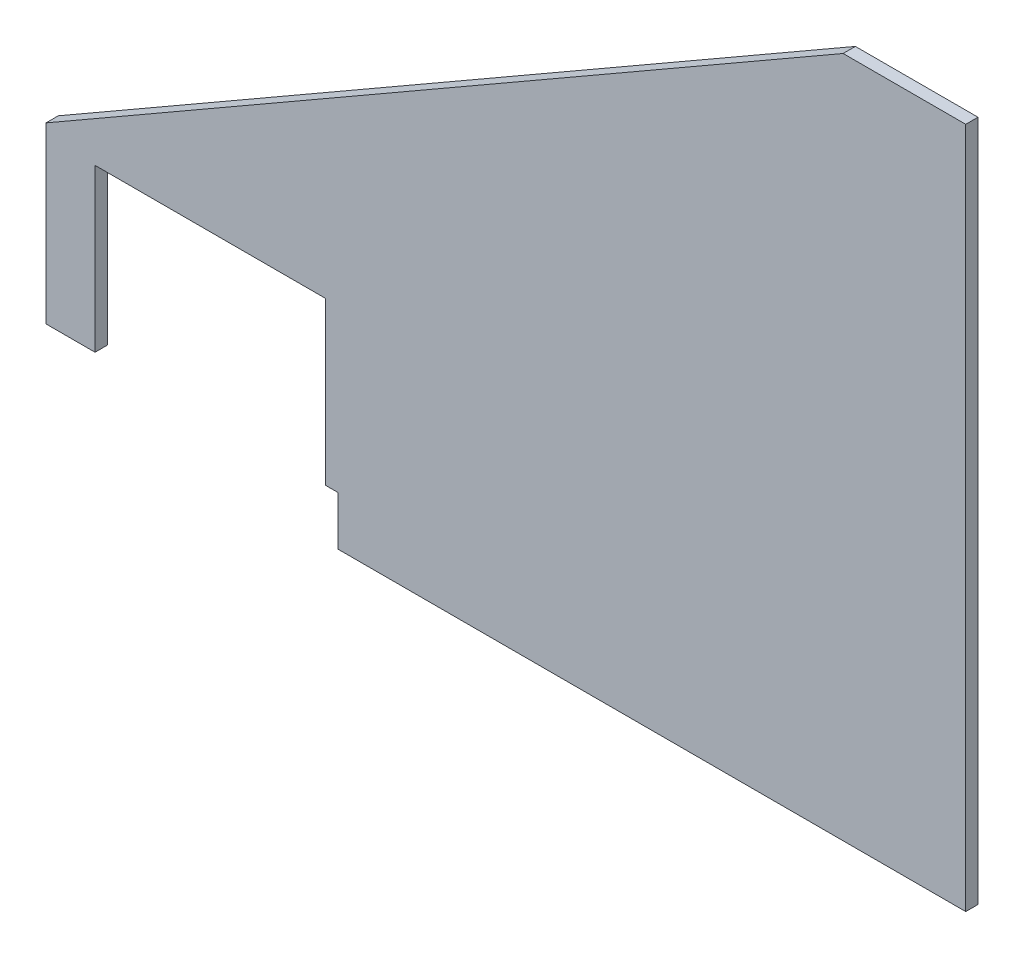
ISO-10303-21;
HEADER;
FILE_DESCRIPTION(('STEP AP214'),'2;1');
FILE_NAME('part.step','',(''),(''),'','','');
FILE_SCHEMA(('AUTOMOTIVE_DESIGN { 1 0 10303 214 1 1 1 1 }'));
ENDSEC;
DATA;
#1=APPLICATION_CONTEXT('core data for automotive mechanical design processes');
#2=APPLICATION_PROTOCOL_DEFINITION('international standard','automotive_design',2000,#1);
#3=PRODUCT_CONTEXT('',#1,'mechanical');
#4=PRODUCT('Part','Part','',(#3));
#5=PRODUCT_RELATED_PRODUCT_CATEGORY('part','',(#4));
#6=PRODUCT_DEFINITION_FORMATION('','',#4);
#7=PRODUCT_DEFINITION_CONTEXT('part definition',#1,'design');
#8=PRODUCT_DEFINITION('design','',#6,#7);
#9=PRODUCT_DEFINITION_SHAPE('','',#8);
#10=(LENGTH_UNIT() NAMED_UNIT(*) SI_UNIT(.MILLI.,.METRE.));
#11=(NAMED_UNIT(*) PLANE_ANGLE_UNIT() SI_UNIT($,.RADIAN.));
#12=(NAMED_UNIT(*) SI_UNIT($,.STERADIAN.) SOLID_ANGLE_UNIT());
#13=UNCERTAINTY_MEASURE_WITH_UNIT(LENGTH_MEASURE(1.E-05),#10,'distance_accuracy_value','');
#14=(GEOMETRIC_REPRESENTATION_CONTEXT(3) GLOBAL_UNCERTAINTY_ASSIGNED_CONTEXT((#13)) GLOBAL_UNIT_ASSIGNED_CONTEXT((#10,
#11,#12)) REPRESENTATION_CONTEXT('',''));
#15=CARTESIAN_POINT('',(0.,0.,0.));
#16=DIRECTION('',(0.,0.,1.));
#17=DIRECTION('',(1.,0.,0.));
#18=AXIS2_PLACEMENT_3D('',#15,#16,#17);
#19=CARTESIAN_POINT('',(128.,139.,5.));
#20=DIRECTION('',(0.,-1.,0.));
#21=DIRECTION('',(1.,0.,0.));
#22=AXIS2_PLACEMENT_3D('',#19,#20,#21);
#23=PLANE('',#22);
#24=DIRECTION('',(-1.,0.,0.));
#25=VECTOR('',#24,1.);
#26=CARTESIAN_POINT('',(128.,139.,0.));
#27=LINE('',#26,#25);
#28=CARTESIAN_POINT('',(128.,139.,0.));
#29=VERTEX_POINT('',#28);
#30=CARTESIAN_POINT('',(77.9999999999999,139.,0.));
#31=VERTEX_POINT('',#30);
#32=EDGE_CURVE('E153',#29,#31,#27,.T.);
#33=ORIENTED_EDGE('',*,*,#32,.T.);
#34=DIRECTION('',(0.,0.,-1.));
#35=VECTOR('',#34,1.);
#36=CARTESIAN_POINT('',(77.9999999999999,139.,5.));
#37=LINE('',#36,#35);
#38=CARTESIAN_POINT('',(77.9999999999999,139.,5.));
#39=VERTEX_POINT('',#38);
#40=EDGE_CURVE('E11',#39,#31,#37,.T.);
#41=ORIENTED_EDGE('',*,*,#40,.F.);
#42=DIRECTION('',(-1.,0.,0.));
#43=VECTOR('',#42,1.);
#44=CARTESIAN_POINT('',(128.,139.,5.));
#45=LINE('',#44,#43);
#46=CARTESIAN_POINT('',(128.,139.,5.));
#47=VERTEX_POINT('',#46);
#48=EDGE_CURVE('E178',#47,#39,#45,.T.);
#49=ORIENTED_EDGE('',*,*,#48,.F.);
#50=DIRECTION('',(0.,0.,-1.));
#51=VECTOR('',#50,1.);
#52=CARTESIAN_POINT('',(128.,139.,5.));
#53=LINE('',#52,#51);
#54=EDGE_CURVE('E152',#47,#29,#53,.T.);
#55=ORIENTED_EDGE('',*,*,#54,.T.);
#56=EDGE_LOOP('',(#33,#41,#49,#55));
#57=FACE_BOUND('',#56,.T.);
#58=ADVANCED_FACE('F37',(#57),#23,.F.);
#59=CARTESIAN_POINT('',(77.9999999999999,139.,5.));
#60=DIRECTION('',(0.498721639903891,-0.866762208389114,0.));
#61=DIRECTION('',(0.866762208389114,0.498721639903891,0.));
#62=AXIS2_PLACEMENT_3D('',#59,#60,#61);
#63=PLANE('',#62);
#64=DIRECTION('',(-0.866762208389114,-0.498721639903891,0.));
#65=VECTOR('',#64,1.);
#66=CARTESIAN_POINT('',(77.9999999999999,139.,0.));
#67=LINE('',#66,#65);
#68=CARTESIAN_POINT('',(-247.,-48.,0.));
#69=VERTEX_POINT('',#68);
#70=EDGE_CURVE('E156',#31,#69,#67,.T.);
#71=ORIENTED_EDGE('',*,*,#70,.T.);
#72=DIRECTION('',(0.,0.,-1.));
#73=VECTOR('',#72,1.);
#74=CARTESIAN_POINT('',(-247.,-48.,5.));
#75=LINE('',#74,#73);
#76=CARTESIAN_POINT('',(-247.,-48.,5.));
#77=VERTEX_POINT('',#76);
#78=EDGE_CURVE('E45',#77,#69,#75,.T.);
#79=ORIENTED_EDGE('',*,*,#78,.F.);
#80=DIRECTION('',(-0.866762208389114,-0.498721639903891,0.));
#81=VECTOR('',#80,1.);
#82=CARTESIAN_POINT('',(77.9999999999999,139.,5.));
#83=LINE('',#82,#81);
#84=EDGE_CURVE('E104',#39,#77,#83,.T.);
#85=ORIENTED_EDGE('',*,*,#84,.F.);
#86=ORIENTED_EDGE('',*,*,#40,.T.);
#87=EDGE_LOOP('',(#71,#79,#85,#86));
#88=FACE_BOUND('',#87,.T.);
#89=ADVANCED_FACE('F242',(#88),#63,.F.);
#90=CARTESIAN_POINT('',(-247.,-48.,5.));
#91=DIRECTION('',(1.,0.,0.));
#92=DIRECTION('',(0.,0.,-1.));
#93=AXIS2_PLACEMENT_3D('',#90,#91,#92);
#94=PLANE('',#93);
#95=DIRECTION('',(0.,-1.,0.));
#96=VECTOR('',#95,1.);
#97=CARTESIAN_POINT('',(-247.,-48.,0.));
#98=LINE('',#97,#96);
#99=CARTESIAN_POINT('',(-247.,-119.,0.));
#100=VERTEX_POINT('',#99);
#101=EDGE_CURVE('E158',#69,#100,#98,.T.);
#102=ORIENTED_EDGE('',*,*,#101,.T.);
#103=DIRECTION('',(0.,0.,-1.));
#104=VECTOR('',#103,1.);
#105=CARTESIAN_POINT('',(-247.,-119.,5.));
#106=LINE('',#105,#104);
#107=CARTESIAN_POINT('',(-247.,-119.,5.));
#108=VERTEX_POINT('',#107);
#109=EDGE_CURVE('E190',#108,#100,#106,.T.);
#110=ORIENTED_EDGE('',*,*,#109,.F.);
#111=DIRECTION('',(0.,-1.,0.));
#112=VECTOR('',#111,1.);
#113=CARTESIAN_POINT('',(-247.,-48.,5.));
#114=LINE('',#113,#112);
#115=EDGE_CURVE('E198',#77,#108,#114,.T.);
#116=ORIENTED_EDGE('',*,*,#115,.F.);
#117=ORIENTED_EDGE('',*,*,#78,.T.);
#118=EDGE_LOOP('',(#102,#110,#116,#117));
#119=FACE_BOUND('',#118,.T.);
#120=ADVANCED_FACE('F196',(#119),#94,.F.);
#121=CARTESIAN_POINT('',(-247.,-119.,5.));
#122=DIRECTION('',(0.,1.,0.));
#123=DIRECTION('',(-1.,0.,0.));
#124=AXIS2_PLACEMENT_3D('',#121,#122,#123);
#125=PLANE('',#124);
#126=DIRECTION('',(1.,0.,0.));
#127=VECTOR('',#126,1.);
#128=CARTESIAN_POINT('',(-247.,-119.,0.));
#129=LINE('',#128,#127);
#130=CARTESIAN_POINT('',(-227.,-119.,0.));
#131=VERTEX_POINT('',#130);
#132=EDGE_CURVE('E160',#100,#131,#129,.T.);
#133=ORIENTED_EDGE('',*,*,#132,.T.);
#134=DIRECTION('',(0.,0.,-1.));
#135=VECTOR('',#134,1.);
#136=CARTESIAN_POINT('',(-227.,-119.,5.));
#137=LINE('',#136,#135);
#138=CARTESIAN_POINT('',(-227.,-119.,5.));
#139=VERTEX_POINT('',#138);
#140=EDGE_CURVE('E188',#139,#131,#137,.T.);
#141=ORIENTED_EDGE('',*,*,#140,.F.);
#142=DIRECTION('',(1.,0.,0.));
#143=VECTOR('',#142,1.);
#144=CARTESIAN_POINT('',(-247.,-119.,5.));
#145=LINE('',#144,#143);
#146=EDGE_CURVE('E209',#108,#139,#145,.T.);
#147=ORIENTED_EDGE('',*,*,#146,.F.);
#148=ORIENTED_EDGE('',*,*,#109,.T.);
#149=EDGE_LOOP('',(#133,#141,#147,#148));
#150=FACE_BOUND('',#149,.T.);
#151=ADVANCED_FACE('F206',(#150),#125,.F.);
#152=CARTESIAN_POINT('',(-227.,-53.,5.));
#153=DIRECTION('',(1.,0.,0.));
#154=DIRECTION('',(0.,1.,0.));
#155=AXIS2_PLACEMENT_3D('',#152,#153,#154);
#156=PLANE('',#155);
#157=DIRECTION('',(0.,-1.,0.));
#158=VECTOR('',#157,1.);
#159=CARTESIAN_POINT('',(-227.,-53.,0.));
#160=LINE('',#159,#158);
#161=CARTESIAN_POINT('',(-227.,-53.,0.));
#162=VERTEX_POINT('',#161);
#163=EDGE_CURVE('E163',#162,#131,#160,.T.);
#164=ORIENTED_EDGE('',*,*,#163,.F.);
#165=DIRECTION('',(0.,0.,-1.));
#166=VECTOR('',#165,1.);
#167=CARTESIAN_POINT('',(-227.,-53.,5.));
#168=LINE('',#167,#166);
#169=CARTESIAN_POINT('',(-227.,-53.,5.));
#170=VERTEX_POINT('',#169);
#171=EDGE_CURVE('E186',#170,#162,#168,.T.);
#172=ORIENTED_EDGE('',*,*,#171,.F.);
#173=DIRECTION('',(0.,-1.,0.));
#174=VECTOR('',#173,1.);
#175=CARTESIAN_POINT('',(-227.,-53.,5.));
#176=LINE('',#175,#174);
#177=EDGE_CURVE('E211',#170,#139,#176,.T.);
#178=ORIENTED_EDGE('',*,*,#177,.T.);
#179=ORIENTED_EDGE('',*,*,#140,.T.);
#180=EDGE_LOOP('',(#164,#172,#178,#179));
#181=FACE_BOUND('',#180,.T.);
#182=ADVANCED_FACE('F253',(#181),#156,.T.);
#183=CARTESIAN_POINT('',(-133.,-53.,5.));
#184=DIRECTION('',(0.,-1.,0.));
#185=DIRECTION('',(0.,0.,-1.));
#186=AXIS2_PLACEMENT_3D('',#183,#184,#185);
#187=PLANE('',#186);
#188=DIRECTION('',(-1.,0.,0.));
#189=VECTOR('',#188,1.);
#190=CARTESIAN_POINT('',(-133.,-53.,0.));
#191=LINE('',#190,#189);
#192=CARTESIAN_POINT('',(-133.,-53.,0.));
#193=VERTEX_POINT('',#192);
#194=EDGE_CURVE('E166',#193,#162,#191,.T.);
#195=ORIENTED_EDGE('',*,*,#194,.F.);
#196=DIRECTION('',(0.,0.,-1.));
#197=VECTOR('',#196,1.);
#198=CARTESIAN_POINT('',(-133.,-53.,5.));
#199=LINE('',#198,#197);
#200=CARTESIAN_POINT('',(-133.,-53.,5.));
#201=VERTEX_POINT('',#200);
#202=EDGE_CURVE('E184',#201,#193,#199,.T.);
#203=ORIENTED_EDGE('',*,*,#202,.F.);
#204=DIRECTION('',(-1.,0.,0.));
#205=VECTOR('',#204,1.);
#206=CARTESIAN_POINT('',(-133.,-53.,5.));
#207=LINE('',#206,#205);
#208=EDGE_CURVE('E213',#201,#170,#207,.T.);
#209=ORIENTED_EDGE('',*,*,#208,.T.);
#210=ORIENTED_EDGE('',*,*,#171,.T.);
#211=EDGE_LOOP('',(#195,#203,#209,#210));
#212=FACE_BOUND('',#211,.T.);
#213=ADVANCED_FACE('F256',(#212),#187,.T.);
#214=CARTESIAN_POINT('',(-133.,-119.,5.));
#215=DIRECTION('',(-1.,0.,0.));
#216=DIRECTION('',(0.,0.,1.));
#217=AXIS2_PLACEMENT_3D('',#214,#215,#216);
#218=PLANE('',#217);
#219=DIRECTION('',(0.,1.,0.));
#220=VECTOR('',#219,1.);
#221=CARTESIAN_POINT('',(-133.,-119.,0.));
#222=LINE('',#221,#220);
#223=CARTESIAN_POINT('',(-133.,-119.,0.));
#224=VERTEX_POINT('',#223);
#225=EDGE_CURVE('E169',#224,#193,#222,.T.);
#226=ORIENTED_EDGE('',*,*,#225,.F.);
#227=DIRECTION('',(0.,0.,-1.));
#228=VECTOR('',#227,1.);
#229=CARTESIAN_POINT('',(-133.,-119.,5.));
#230=LINE('',#229,#228);
#231=CARTESIAN_POINT('',(-133.,-119.,5.));
#232=VERTEX_POINT('',#231);
#233=EDGE_CURVE('E182',#232,#224,#230,.T.);
#234=ORIENTED_EDGE('',*,*,#233,.F.);
#235=DIRECTION('',(0.,1.,0.));
#236=VECTOR('',#235,1.);
#237=CARTESIAN_POINT('',(-133.,-119.,5.));
#238=LINE('',#237,#236);
#239=EDGE_CURVE('E147',#232,#201,#238,.T.);
#240=ORIENTED_EDGE('',*,*,#239,.T.);
#241=ORIENTED_EDGE('',*,*,#202,.T.);
#242=EDGE_LOOP('',(#226,#234,#240,#241));
#243=FACE_BOUND('',#242,.T.);
#244=ADVANCED_FACE('F222',(#243),#218,.T.);
#245=CARTESIAN_POINT('',(-128.,-119.,5.));
#246=DIRECTION('',(0.,-1.,0.));
#247=DIRECTION('',(1.,0.,0.));
#248=AXIS2_PLACEMENT_3D('',#245,#246,#247);
#249=PLANE('',#248);
#250=DIRECTION('',(-1.,0.,0.));
#251=VECTOR('',#250,1.);
#252=CARTESIAN_POINT('',(-128.,-119.,0.));
#253=LINE('',#252,#251);
#254=CARTESIAN_POINT('',(-128.,-119.,0.));
#255=VERTEX_POINT('',#254);
#256=EDGE_CURVE('E172',#255,#224,#253,.T.);
#257=ORIENTED_EDGE('',*,*,#256,.F.);
#258=DIRECTION('',(0.,0.,-1.));
#259=VECTOR('',#258,1.);
#260=CARTESIAN_POINT('',(-128.,-119.,5.));
#261=LINE('',#260,#259);
#262=CARTESIAN_POINT('',(-128.,-119.,5.));
#263=VERTEX_POINT('',#262);
#264=EDGE_CURVE('E135',#263,#255,#261,.T.);
#265=ORIENTED_EDGE('',*,*,#264,.F.);
#266=DIRECTION('',(-1.,0.,0.));
#267=VECTOR('',#266,1.);
#268=CARTESIAN_POINT('',(-128.,-119.,5.));
#269=LINE('',#268,#267);
#270=EDGE_CURVE('E145',#263,#232,#269,.T.);
#271=ORIENTED_EDGE('',*,*,#270,.T.);
#272=ORIENTED_EDGE('',*,*,#233,.T.);
#273=EDGE_LOOP('',(#257,#265,#271,#272));
#274=FACE_BOUND('',#273,.T.);
#275=ADVANCED_FACE('F227',(#274),#249,.T.);
#276=CARTESIAN_POINT('',(-128.,-139.,5.));
#277=DIRECTION('',(-1.,0.,0.));
#278=DIRECTION('',(0.,0.,1.));
#279=AXIS2_PLACEMENT_3D('',#276,#277,#278);
#280=PLANE('',#279);
#281=DIRECTION('',(0.,1.,0.));
#282=VECTOR('',#281,1.);
#283=CARTESIAN_POINT('',(-128.,-139.,0.));
#284=LINE('',#283,#282);
#285=CARTESIAN_POINT('',(-128.,-139.,0.));
#286=VERTEX_POINT('',#285);
#287=EDGE_CURVE('E134',#286,#255,#284,.T.);
#288=ORIENTED_EDGE('',*,*,#287,.F.);
#289=DIRECTION('',(0.,0.,-1.));
#290=VECTOR('',#289,1.);
#291=CARTESIAN_POINT('',(-128.,-139.,5.));
#292=LINE('',#291,#290);
#293=CARTESIAN_POINT('',(-128.,-139.,5.));
#294=VERTEX_POINT('',#293);
#295=EDGE_CURVE('E128',#294,#286,#292,.T.);
#296=ORIENTED_EDGE('',*,*,#295,.F.);
#297=DIRECTION('',(0.,1.,0.));
#298=VECTOR('',#297,1.);
#299=CARTESIAN_POINT('',(-128.,-139.,5.));
#300=LINE('',#299,#298);
#301=EDGE_CURVE('E132',#294,#263,#300,.T.);
#302=ORIENTED_EDGE('',*,*,#301,.T.);
#303=ORIENTED_EDGE('',*,*,#264,.T.);
#304=EDGE_LOOP('',(#288,#296,#302,#303));
#305=FACE_BOUND('',#304,.T.);
#306=ADVANCED_FACE('F130',(#305),#280,.T.);
#307=CARTESIAN_POINT('',(-128.,-139.,5.));
#308=DIRECTION('',(0.,1.,0.));
#309=DIRECTION('',(0.,0.,1.));
#310=AXIS2_PLACEMENT_3D('',#307,#308,#309);
#311=PLANE('',#310);
#312=DIRECTION('',(1.,0.,0.));
#313=VECTOR('',#312,1.);
#314=CARTESIAN_POINT('',(-128.,-139.,0.));
#315=LINE('',#314,#313);
#316=CARTESIAN_POINT('',(128.,-139.,0.));
#317=VERTEX_POINT('',#316);
#318=EDGE_CURVE('E90',#286,#317,#315,.T.);
#319=ORIENTED_EDGE('',*,*,#318,.T.);
#320=DIRECTION('',(0.,0.,-1.));
#321=VECTOR('',#320,1.);
#322=CARTESIAN_POINT('',(128.,-139.,5.));
#323=LINE('',#322,#321);
#324=CARTESIAN_POINT('',(128.,-139.,5.));
#325=VERTEX_POINT('',#324);
#326=EDGE_CURVE('E136',#325,#317,#323,.T.);
#327=ORIENTED_EDGE('',*,*,#326,.F.);
#328=DIRECTION('',(1.,0.,0.));
#329=VECTOR('',#328,1.);
#330=CARTESIAN_POINT('',(-128.,-139.,5.));
#331=LINE('',#330,#329);
#332=EDGE_CURVE('E138',#294,#325,#331,.T.);
#333=ORIENTED_EDGE('',*,*,#332,.F.);
#334=ORIENTED_EDGE('',*,*,#295,.T.);
#335=EDGE_LOOP('',(#319,#327,#333,#334));
#336=FACE_BOUND('',#335,.T.);
#337=ADVANCED_FACE('F139',(#336),#311,.F.);
#338=CARTESIAN_POINT('',(128.,-139.,5.));
#339=DIRECTION('',(-1.,0.,0.));
#340=DIRECTION('',(0.,-1.,0.));
#341=AXIS2_PLACEMENT_3D('',#338,#339,#340);
#342=PLANE('',#341);
#343=DIRECTION('',(0.,1.,0.));
#344=VECTOR('',#343,1.);
#345=CARTESIAN_POINT('',(128.,-139.,0.));
#346=LINE('',#345,#344);
#347=EDGE_CURVE('E96',#317,#29,#346,.T.);
#348=ORIENTED_EDGE('',*,*,#347,.T.);
#349=ORIENTED_EDGE('',*,*,#54,.F.);
#350=DIRECTION('',(0.,1.,0.));
#351=VECTOR('',#350,1.);
#352=CARTESIAN_POINT('',(128.,-139.,5.));
#353=LINE('',#352,#351);
#354=EDGE_CURVE('E53',#325,#47,#353,.T.);
#355=ORIENTED_EDGE('',*,*,#354,.F.);
#356=ORIENTED_EDGE('',*,*,#326,.T.);
#357=EDGE_LOOP('',(#348,#349,#355,#356));
#358=FACE_BOUND('',#357,.T.);
#359=ADVANCED_FACE('F231',(#358),#342,.F.);
#360=CARTESIAN_POINT('',(0.,0.,5.));
#361=DIRECTION('',(0.,0.,1.));
#362=DIRECTION('',(1.,0.,0.));
#363=AXIS2_PLACEMENT_3D('',#360,#361,#362);
#364=PLANE('',#363);
#365=ORIENTED_EDGE('',*,*,#48,.T.);
#366=ORIENTED_EDGE('',*,*,#84,.T.);
#367=ORIENTED_EDGE('',*,*,#115,.T.);
#368=ORIENTED_EDGE('',*,*,#146,.T.);
#369=ORIENTED_EDGE('',*,*,#177,.F.);
#370=ORIENTED_EDGE('',*,*,#208,.F.);
#371=ORIENTED_EDGE('',*,*,#239,.F.);
#372=ORIENTED_EDGE('',*,*,#270,.F.);
#373=ORIENTED_EDGE('',*,*,#301,.F.);
#374=ORIENTED_EDGE('',*,*,#332,.T.);
#375=ORIENTED_EDGE('',*,*,#354,.T.);
#376=EDGE_LOOP('',(#365,#366,#367,#368,#369,#370,#371,#372,#373,#374,#375));
#377=FACE_BOUND('',#376,.T.);
#378=ADVANCED_FACE('F142',(#377),#364,.T.);
#379=CARTESIAN_POINT('',(0.,0.,0.));
#380=DIRECTION('',(0.,0.,1.));
#381=DIRECTION('',(1.,0.,0.));
#382=AXIS2_PLACEMENT_3D('',#379,#380,#381);
#383=PLANE('',#382);
#384=ORIENTED_EDGE('',*,*,#32,.F.);
#385=ORIENTED_EDGE('',*,*,#347,.F.);
#386=ORIENTED_EDGE('',*,*,#318,.F.);
#387=ORIENTED_EDGE('',*,*,#287,.T.);
#388=ORIENTED_EDGE('',*,*,#256,.T.);
#389=ORIENTED_EDGE('',*,*,#225,.T.);
#390=ORIENTED_EDGE('',*,*,#194,.T.);
#391=ORIENTED_EDGE('',*,*,#163,.T.);
#392=ORIENTED_EDGE('',*,*,#132,.F.);
#393=ORIENTED_EDGE('',*,*,#101,.F.);
#394=ORIENTED_EDGE('',*,*,#70,.F.);
#395=EDGE_LOOP('',(#384,#385,#386,#387,#388,#389,#390,#391,#392,#393,#394));
#396=FACE_BOUND('',#395,.T.);
#397=ADVANCED_FACE('F202',(#396),#383,.F.);
#398=CLOSED_SHELL('',(#58,#89,#120,#151,#182,#213,#244,#275,#306,#337,#359,#378,#397));
#399=MANIFOLD_SOLID_BREP('B2',#398);
#400=ADVANCED_BREP_SHAPE_REPRESENTATION('',(#18,#399),#14);
#401=SHAPE_DEFINITION_REPRESENTATION(#9,#400);
ENDSEC;
END-ISO-10303-21;
